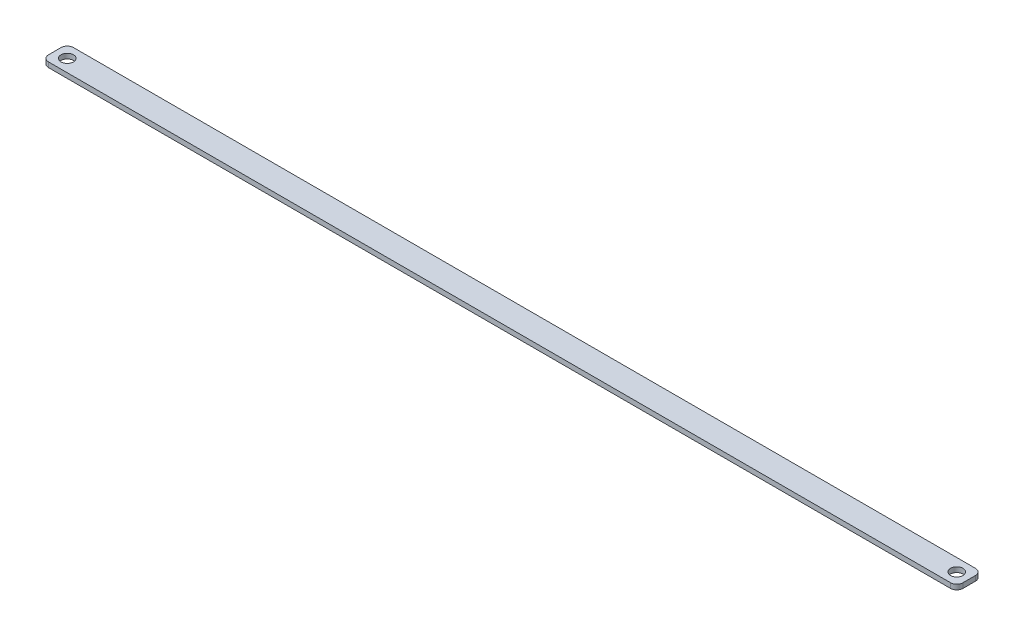
ISO-10303-21;
HEADER;
FILE_DESCRIPTION(('STEP AP214'),'2;1');
FILE_NAME('part.step','',(''),(''),'','','');
FILE_SCHEMA(('AUTOMOTIVE_DESIGN { 1 0 10303 214 1 1 1 1 }'));
ENDSEC;
DATA;
#1=APPLICATION_CONTEXT('core data for automotive mechanical design processes');
#2=APPLICATION_PROTOCOL_DEFINITION('international standard','automotive_design',2000,#1);
#3=PRODUCT_CONTEXT('',#1,'mechanical');
#4=PRODUCT('Part','Part','',(#3));
#5=PRODUCT_RELATED_PRODUCT_CATEGORY('part','',(#4));
#6=PRODUCT_DEFINITION_FORMATION('','',#4);
#7=PRODUCT_DEFINITION_CONTEXT('part definition',#1,'design');
#8=PRODUCT_DEFINITION('design','',#6,#7);
#9=PRODUCT_DEFINITION_SHAPE('','',#8);
#10=(LENGTH_UNIT() NAMED_UNIT(*) SI_UNIT(.MILLI.,.METRE.));
#11=(NAMED_UNIT(*) PLANE_ANGLE_UNIT() SI_UNIT($,.RADIAN.));
#12=(NAMED_UNIT(*) SI_UNIT($,.STERADIAN.) SOLID_ANGLE_UNIT());
#13=UNCERTAINTY_MEASURE_WITH_UNIT(LENGTH_MEASURE(1.E-05),#10,'distance_accuracy_value','');
#14=(GEOMETRIC_REPRESENTATION_CONTEXT(3) GLOBAL_UNCERTAINTY_ASSIGNED_CONTEXT((#13)) GLOBAL_UNIT_ASSIGNED_CONTEXT((#10,
#11,#12)) REPRESENTATION_CONTEXT('',''));
#15=CARTESIAN_POINT('',(0.,0.,0.));
#16=DIRECTION('',(0.,0.,1.));
#17=DIRECTION('',(1.,0.,0.));
#18=AXIS2_PLACEMENT_3D('',#15,#16,#17);
#19=CARTESIAN_POINT('',(207.32774118692,2.,-5.));
#20=DIRECTION('',(0.,-1.,0.));
#21=DIRECTION('',(0.,0.,-1.));
#22=AXIS2_PLACEMENT_3D('',#19,#20,#21);
#23=CYLINDRICAL_SURFACE('',#22,2.5);
#24=CARTESIAN_POINT('',(207.32774118692,0.,-5.));
#25=DIRECTION('',(0.,1.,0.));
#26=DIRECTION('',(0.,0.,1.));
#27=AXIS2_PLACEMENT_3D('',#24,#25,#26);
#28=CIRCLE('',#27,2.5);
#29=CARTESIAN_POINT('',(207.32774118692,0.,-2.5));
#30=VERTEX_POINT('',#29);
#31=EDGE_CURVE('E220',#30,#30,#28,.T.);
#32=ORIENTED_EDGE('',*,*,#31,.F.);
#33=EDGE_LOOP('',(#32));
#34=FACE_BOUND('',#33,.T.);
#35=CARTESIAN_POINT('',(207.32774118692,2.,-5.));
#36=DIRECTION('',(0.,1.,0.));
#37=DIRECTION('',(0.,0.,1.));
#38=AXIS2_PLACEMENT_3D('',#35,#36,#37);
#39=CIRCLE('',#38,2.5);
#40=CARTESIAN_POINT('',(207.32774118692,2.,-2.5));
#41=VERTEX_POINT('',#40);
#42=EDGE_CURVE('E13',#41,#41,#39,.T.);
#43=ORIENTED_EDGE('',*,*,#42,.T.);
#44=EDGE_LOOP('',(#43));
#45=FACE_BOUND('',#44,.T.);
#46=ADVANCED_FACE('F93',(#34,#45),#23,.F.);
#47=CARTESIAN_POINT('',(-149.67225881308,2.,-5.));
#48=DIRECTION('',(0.,-1.,0.));
#49=DIRECTION('',(0.,0.,-1.));
#50=AXIS2_PLACEMENT_3D('',#47,#48,#49);
#51=CYLINDRICAL_SURFACE('',#50,2.5);
#52=CARTESIAN_POINT('',(-149.67225881308,0.,-5.));
#53=DIRECTION('',(0.,1.,0.));
#54=DIRECTION('',(0.,0.,1.));
#55=AXIS2_PLACEMENT_3D('',#52,#53,#54);
#56=CIRCLE('',#55,2.5);
#57=CARTESIAN_POINT('',(-149.67225881308,0.,-2.5));
#58=VERTEX_POINT('',#57);
#59=EDGE_CURVE('E233',#58,#58,#56,.T.);
#60=ORIENTED_EDGE('',*,*,#59,.F.);
#61=EDGE_LOOP('',(#60));
#62=FACE_BOUND('',#61,.T.);
#63=CARTESIAN_POINT('',(-149.67225881308,2.,-5.));
#64=DIRECTION('',(0.,1.,0.));
#65=DIRECTION('',(0.,0.,1.));
#66=AXIS2_PLACEMENT_3D('',#63,#64,#65);
#67=CIRCLE('',#66,2.5);
#68=CARTESIAN_POINT('',(-149.67225881308,2.,-2.5));
#69=VERTEX_POINT('',#68);
#70=EDGE_CURVE('E103',#69,#69,#67,.T.);
#71=ORIENTED_EDGE('',*,*,#70,.T.);
#72=EDGE_LOOP('',(#71));
#73=FACE_BOUND('',#72,.T.);
#74=ADVANCED_FACE('F254',(#62,#73),#51,.F.);
#75=CARTESIAN_POINT('',(47.5,2.,-2.5));
#76=DIRECTION('',(0.,1.,0.));
#77=DIRECTION('',(0.,0.,1.));
#78=AXIS2_PLACEMENT_3D('',#75,#76,#77);
#79=PLANE('',#78);
#80=DIRECTION('',(1.,0.,0.));
#81=VECTOR('',#80,1.);
#82=CARTESIAN_POINT('',(-152.17225881308,2.,0.));
#83=LINE('',#82,#81);
#84=CARTESIAN_POINT('',(-152.17225881308,2.,0.));
#85=VERTEX_POINT('',#84);
#86=CARTESIAN_POINT('',(209.82774118692,2.,0.));
#87=VERTEX_POINT('',#86);
#88=EDGE_CURVE('E156',#85,#87,#83,.T.);
#89=ORIENTED_EDGE('',*,*,#88,.T.);
#90=CARTESIAN_POINT('',(209.82774118692,2.,-2.5));
#91=DIRECTION('',(0.,1.,0.));
#92=DIRECTION('',(0.,0.,1.));
#93=AXIS2_PLACEMENT_3D('',#90,#91,#92);
#94=CIRCLE('',#93,2.5);
#95=CARTESIAN_POINT('',(212.32774118692,2.,-2.50000000000002));
#96=VERTEX_POINT('',#95);
#97=EDGE_CURVE('E162',#87,#96,#94,.T.);
#98=ORIENTED_EDGE('',*,*,#97,.T.);
#99=DIRECTION('',(0.,0.,-1.));
#100=VECTOR('',#99,1.);
#101=CARTESIAN_POINT('',(212.32774118692,2.,-2.50000000000002));
#102=LINE('',#101,#100);
#103=CARTESIAN_POINT('',(212.32774118692,2.,-7.49999999999998));
#104=VERTEX_POINT('',#103);
#105=EDGE_CURVE('E184',#96,#104,#102,.T.);
#106=ORIENTED_EDGE('',*,*,#105,.T.);
#107=CARTESIAN_POINT('',(209.82774118692,2.,-7.5));
#108=DIRECTION('',(0.,1.,0.));
#109=DIRECTION('',(0.,0.,-1.));
#110=AXIS2_PLACEMENT_3D('',#107,#108,#109);
#111=CIRCLE('',#110,2.5);
#112=CARTESIAN_POINT('',(209.82774118692,2.,-10.));
#113=VERTEX_POINT('',#112);
#114=EDGE_CURVE('E188',#104,#113,#111,.T.);
#115=ORIENTED_EDGE('',*,*,#114,.T.);
#116=DIRECTION('',(-1.,0.,0.));
#117=VECTOR('',#116,1.);
#118=CARTESIAN_POINT('',(164.82774118692,2.,-10.));
#119=LINE('',#118,#117);
#120=CARTESIAN_POINT('',(-152.17225881308,2.,-10.));
#121=VERTEX_POINT('',#120);
#122=EDGE_CURVE('E242',#113,#121,#119,.T.);
#123=ORIENTED_EDGE('',*,*,#122,.T.);
#124=CARTESIAN_POINT('',(-152.17225881308,2.,-7.5));
#125=DIRECTION('',(0.,1.,0.));
#126=DIRECTION('',(0.,0.,-1.));
#127=AXIS2_PLACEMENT_3D('',#124,#125,#126);
#128=CIRCLE('',#127,2.5);
#129=CARTESIAN_POINT('',(-154.67225881308,2.,-7.49999999999998));
#130=VERTEX_POINT('',#129);
#131=EDGE_CURVE('E168',#121,#130,#128,.T.);
#132=ORIENTED_EDGE('',*,*,#131,.T.);
#133=DIRECTION('',(0.,0.,1.));
#134=VECTOR('',#133,1.);
#135=CARTESIAN_POINT('',(-154.67225881308,2.,-2.50000000000002));
#136=LINE('',#135,#134);
#137=CARTESIAN_POINT('',(-154.67225881308,2.,-2.50000000000002));
#138=VERTEX_POINT('',#137);
#139=EDGE_CURVE('E186',#130,#138,#136,.T.);
#140=ORIENTED_EDGE('',*,*,#139,.T.);
#141=CARTESIAN_POINT('',(-152.17225881308,2.,-2.5));
#142=DIRECTION('',(0.,1.,0.));
#143=DIRECTION('',(0.,0.,-1.));
#144=AXIS2_PLACEMENT_3D('',#141,#142,#143);
#145=CIRCLE('',#144,2.5);
#146=EDGE_CURVE('E165',#138,#85,#145,.T.);
#147=ORIENTED_EDGE('',*,*,#146,.T.);
#148=EDGE_LOOP('',(#89,#98,#106,#115,#123,#132,#140,#147));
#149=FACE_BOUND('',#148,.T.);
#150=ORIENTED_EDGE('',*,*,#42,.F.);
#151=EDGE_LOOP('',(#150));
#152=FACE_BOUND('',#151,.T.);
#153=ORIENTED_EDGE('',*,*,#70,.F.);
#154=EDGE_LOOP('',(#153));
#155=FACE_BOUND('',#154,.T.);
#156=ADVANCED_FACE('F158',(#149,#152,#155),#79,.T.);
#157=CARTESIAN_POINT('',(209.82774118692,0.,-2.5));
#158=DIRECTION('',(0.,1.,0.));
#159=DIRECTION('',(0.,0.,1.));
#160=AXIS2_PLACEMENT_3D('',#157,#158,#159);
#161=PLANE('',#160);
#162=ORIENTED_EDGE('',*,*,#31,.T.);
#163=EDGE_LOOP('',(#162));
#164=FACE_BOUND('',#163,.T.);
#165=CARTESIAN_POINT('',(209.82774118692,0.,-2.5));
#166=DIRECTION('',(0.,1.,0.));
#167=DIRECTION('',(0.,0.,1.));
#168=AXIS2_PLACEMENT_3D('',#165,#166,#167);
#169=CIRCLE('',#168,2.5);
#170=CARTESIAN_POINT('',(209.82774118692,0.,0.));
#171=VERTEX_POINT('',#170);
#172=CARTESIAN_POINT('',(212.32774118692,0.,-2.50000000000002));
#173=VERTEX_POINT('',#172);
#174=EDGE_CURVE('E177',#171,#173,#169,.T.);
#175=ORIENTED_EDGE('',*,*,#174,.F.);
#176=DIRECTION('',(1.,0.,0.));
#177=VECTOR('',#176,1.);
#178=CARTESIAN_POINT('',(-152.17225881308,0.,0.));
#179=LINE('',#178,#177);
#180=CARTESIAN_POINT('',(-152.17225881308,0.,0.));
#181=VERTEX_POINT('',#180);
#182=EDGE_CURVE('E173',#181,#171,#179,.T.);
#183=ORIENTED_EDGE('',*,*,#182,.F.);
#184=CARTESIAN_POINT('',(-152.17225881308,0.,-2.5));
#185=DIRECTION('',(0.,1.,0.));
#186=DIRECTION('',(0.,0.,-1.));
#187=AXIS2_PLACEMENT_3D('',#184,#185,#186);
#188=CIRCLE('',#187,2.5);
#189=CARTESIAN_POINT('',(-154.67225881308,0.,-2.50000000000002));
#190=VERTEX_POINT('',#189);
#191=EDGE_CURVE('E199',#190,#181,#188,.T.);
#192=ORIENTED_EDGE('',*,*,#191,.F.);
#193=DIRECTION('',(0.,0.,1.));
#194=VECTOR('',#193,1.);
#195=CARTESIAN_POINT('',(-154.67225881308,0.,-2.50000000000002));
#196=LINE('',#195,#194);
#197=CARTESIAN_POINT('',(-154.67225881308,0.,-7.49999999999998));
#198=VERTEX_POINT('',#197);
#199=EDGE_CURVE('E206',#198,#190,#196,.T.);
#200=ORIENTED_EDGE('',*,*,#199,.F.);
#201=CARTESIAN_POINT('',(-152.17225881308,0.,-7.5));
#202=DIRECTION('',(0.,1.,0.));
#203=DIRECTION('',(0.,0.,-1.));
#204=AXIS2_PLACEMENT_3D('',#201,#202,#203);
#205=CIRCLE('',#204,2.5);
#206=CARTESIAN_POINT('',(-152.17225881308,0.,-10.));
#207=VERTEX_POINT('',#206);
#208=EDGE_CURVE('E212',#207,#198,#205,.T.);
#209=ORIENTED_EDGE('',*,*,#208,.F.);
#210=DIRECTION('',(-1.,0.,0.));
#211=VECTOR('',#210,1.);
#212=CARTESIAN_POINT('',(164.82774118692,0.,-10.));
#213=LINE('',#212,#211);
#214=CARTESIAN_POINT('',(209.82774118692,0.,-10.));
#215=VERTEX_POINT('',#214);
#216=EDGE_CURVE('E218',#215,#207,#213,.T.);
#217=ORIENTED_EDGE('',*,*,#216,.F.);
#218=CARTESIAN_POINT('',(209.82774118692,0.,-7.5));
#219=DIRECTION('',(0.,1.,0.));
#220=DIRECTION('',(0.,0.,-1.));
#221=AXIS2_PLACEMENT_3D('',#218,#219,#220);
#222=CIRCLE('',#221,2.5);
#223=CARTESIAN_POINT('',(212.32774118692,0.,-7.49999999999998));
#224=VERTEX_POINT('',#223);
#225=EDGE_CURVE('E223',#224,#215,#222,.T.);
#226=ORIENTED_EDGE('',*,*,#225,.F.);
#227=DIRECTION('',(0.,0.,-1.));
#228=VECTOR('',#227,1.);
#229=CARTESIAN_POINT('',(212.32774118692,0.,-2.50000000000002));
#230=LINE('',#229,#228);
#231=EDGE_CURVE('E178',#173,#224,#230,.T.);
#232=ORIENTED_EDGE('',*,*,#231,.F.);
#233=EDGE_LOOP('',(#175,#183,#192,#200,#209,#217,#226,#232));
#234=FACE_BOUND('',#233,.T.);
#235=ORIENTED_EDGE('',*,*,#59,.T.);
#236=EDGE_LOOP('',(#235));
#237=FACE_BOUND('',#236,.T.);
#238=ADVANCED_FACE('F249',(#164,#234,#237),#161,.F.);
#239=CARTESIAN_POINT('',(164.82774118692,2.,-10.));
#240=DIRECTION('',(0.,0.,1.));
#241=DIRECTION('',(1.,0.,0.));
#242=AXIS2_PLACEMENT_3D('',#239,#240,#241);
#243=PLANE('',#242);
#244=ORIENTED_EDGE('',*,*,#216,.T.);
#245=DIRECTION('',(0.,-1.,0.));
#246=VECTOR('',#245,1.);
#247=CARTESIAN_POINT('',(-152.17225881308,2.,-10.));
#248=LINE('',#247,#246);
#249=EDGE_CURVE('E209',#121,#207,#248,.T.);
#250=ORIENTED_EDGE('',*,*,#249,.F.);
#251=ORIENTED_EDGE('',*,*,#122,.F.);
#252=DIRECTION('',(0.,-1.,0.));
#253=VECTOR('',#252,1.);
#254=CARTESIAN_POINT('',(209.82774118692,2.,-10.));
#255=LINE('',#254,#253);
#256=EDGE_CURVE('E112',#113,#215,#255,.T.);
#257=ORIENTED_EDGE('',*,*,#256,.T.);
#258=EDGE_LOOP('',(#244,#250,#251,#257));
#259=FACE_BOUND('',#258,.T.);
#260=ADVANCED_FACE('F271',(#259),#243,.F.);
#261=CARTESIAN_POINT('',(164.82774118692,2.,0.));
#262=DIRECTION('',(0.,0.,-1.));
#263=DIRECTION('',(-1.,0.,0.));
#264=AXIS2_PLACEMENT_3D('',#261,#262,#263);
#265=PLANE('',#264);
#266=DIRECTION('',(0.,-1.,0.));
#267=VECTOR('',#266,1.);
#268=CARTESIAN_POINT('',(209.82774118692,2.,0.));
#269=LINE('',#268,#267);
#270=EDGE_CURVE('E171',#87,#171,#269,.T.);
#271=ORIENTED_EDGE('',*,*,#270,.F.);
#272=ORIENTED_EDGE('',*,*,#88,.F.);
#273=DIRECTION('',(0.,-1.,0.));
#274=VECTOR('',#273,1.);
#275=CARTESIAN_POINT('',(-152.17225881308,2.,0.));
#276=LINE('',#275,#274);
#277=EDGE_CURVE('E196',#85,#181,#276,.T.);
#278=ORIENTED_EDGE('',*,*,#277,.T.);
#279=ORIENTED_EDGE('',*,*,#182,.T.);
#280=EDGE_LOOP('',(#271,#272,#278,#279));
#281=FACE_BOUND('',#280,.T.);
#282=ADVANCED_FACE('F172',(#281),#265,.F.);
#283=CARTESIAN_POINT('',(209.82774118692,2.,-2.5));
#284=DIRECTION('',(0.,-1.,0.));
#285=DIRECTION('',(0.,0.,-1.));
#286=AXIS2_PLACEMENT_3D('',#283,#284,#285);
#287=CYLINDRICAL_SURFACE('',#286,2.5);
#288=ORIENTED_EDGE('',*,*,#174,.T.);
#289=DIRECTION('',(0.,-1.,0.));
#290=VECTOR('',#289,1.);
#291=CARTESIAN_POINT('',(212.32774118692,2.,-2.50000000000002));
#292=LINE('',#291,#290);
#293=EDGE_CURVE('E182',#96,#173,#292,.T.);
#294=ORIENTED_EDGE('',*,*,#293,.F.);
#295=ORIENTED_EDGE('',*,*,#97,.F.);
#296=ORIENTED_EDGE('',*,*,#270,.T.);
#297=EDGE_LOOP('',(#288,#294,#295,#296));
#298=FACE_BOUND('',#297,.T.);
#299=ADVANCED_FACE('F180',(#298),#287,.T.);
#300=CARTESIAN_POINT('',(212.32774118692,2.,-2.50000000000002));
#301=DIRECTION('',(-1.,0.,0.));
#302=DIRECTION('',(0.,0.,1.));
#303=AXIS2_PLACEMENT_3D('',#300,#301,#302);
#304=PLANE('',#303);
#305=ORIENTED_EDGE('',*,*,#231,.T.);
#306=DIRECTION('',(0.,-1.,0.));
#307=VECTOR('',#306,1.);
#308=CARTESIAN_POINT('',(212.32774118692,2.,-7.49999999999998));
#309=LINE('',#308,#307);
#310=EDGE_CURVE('E215',#104,#224,#309,.T.);
#311=ORIENTED_EDGE('',*,*,#310,.F.);
#312=ORIENTED_EDGE('',*,*,#105,.F.);
#313=ORIENTED_EDGE('',*,*,#293,.T.);
#314=EDGE_LOOP('',(#305,#311,#312,#313));
#315=FACE_BOUND('',#314,.T.);
#316=ADVANCED_FACE('F278',(#315),#304,.F.);
#317=CARTESIAN_POINT('',(209.82774118692,2.,-7.5));
#318=DIRECTION('',(0.,-1.,0.));
#319=DIRECTION('',(0.,0.,-1.));
#320=AXIS2_PLACEMENT_3D('',#317,#318,#319);
#321=CYLINDRICAL_SURFACE('',#320,2.5);
#322=ORIENTED_EDGE('',*,*,#225,.T.);
#323=ORIENTED_EDGE('',*,*,#256,.F.);
#324=ORIENTED_EDGE('',*,*,#114,.F.);
#325=ORIENTED_EDGE('',*,*,#310,.T.);
#326=EDGE_LOOP('',(#322,#323,#324,#325));
#327=FACE_BOUND('',#326,.T.);
#328=ADVANCED_FACE('F281',(#327),#321,.T.);
#329=CARTESIAN_POINT('',(-152.17225881308,2.,-7.5));
#330=DIRECTION('',(0.,-1.,0.));
#331=DIRECTION('',(0.,0.,-1.));
#332=AXIS2_PLACEMENT_3D('',#329,#330,#331);
#333=CYLINDRICAL_SURFACE('',#332,2.5);
#334=ORIENTED_EDGE('',*,*,#208,.T.);
#335=DIRECTION('',(0.,-1.,0.));
#336=VECTOR('',#335,1.);
#337=CARTESIAN_POINT('',(-154.67225881308,2.,-7.49999999999998));
#338=LINE('',#337,#336);
#339=EDGE_CURVE('E202',#130,#198,#338,.T.);
#340=ORIENTED_EDGE('',*,*,#339,.F.);
#341=ORIENTED_EDGE('',*,*,#131,.F.);
#342=ORIENTED_EDGE('',*,*,#249,.T.);
#343=EDGE_LOOP('',(#334,#340,#341,#342));
#344=FACE_BOUND('',#343,.T.);
#345=ADVANCED_FACE('F285',(#344),#333,.T.);
#346=CARTESIAN_POINT('',(-154.67225881308,2.,-2.50000000000002));
#347=DIRECTION('',(1.,0.,0.));
#348=DIRECTION('',(0.,0.,-1.));
#349=AXIS2_PLACEMENT_3D('',#346,#347,#348);
#350=PLANE('',#349);
#351=ORIENTED_EDGE('',*,*,#199,.T.);
#352=DIRECTION('',(0.,-1.,0.));
#353=VECTOR('',#352,1.);
#354=CARTESIAN_POINT('',(-154.67225881308,2.,-2.50000000000002));
#355=LINE('',#354,#353);
#356=EDGE_CURVE('E203',#138,#190,#355,.T.);
#357=ORIENTED_EDGE('',*,*,#356,.F.);
#358=ORIENTED_EDGE('',*,*,#139,.F.);
#359=ORIENTED_EDGE('',*,*,#339,.T.);
#360=EDGE_LOOP('',(#351,#357,#358,#359));
#361=FACE_BOUND('',#360,.T.);
#362=ADVANCED_FACE('F288',(#361),#350,.F.);
#363=CARTESIAN_POINT('',(-152.17225881308,2.,-2.5));
#364=DIRECTION('',(0.,-1.,0.));
#365=DIRECTION('',(0.,0.,-1.));
#366=AXIS2_PLACEMENT_3D('',#363,#364,#365);
#367=CYLINDRICAL_SURFACE('',#366,2.5);
#368=ORIENTED_EDGE('',*,*,#191,.T.);
#369=ORIENTED_EDGE('',*,*,#277,.F.);
#370=ORIENTED_EDGE('',*,*,#146,.F.);
#371=ORIENTED_EDGE('',*,*,#356,.T.);
#372=EDGE_LOOP('',(#368,#369,#370,#371));
#373=FACE_BOUND('',#372,.T.);
#374=ADVANCED_FACE('F95',(#373),#367,.T.);
#375=CLOSED_SHELL('',(#46,#74,#156,#238,#260,#282,#299,#316,#328,#345,#362,#374));
#376=MANIFOLD_SOLID_BREP('B2',#375);
#377=ADVANCED_BREP_SHAPE_REPRESENTATION('',(#18,#376),#14);
#378=SHAPE_DEFINITION_REPRESENTATION(#9,#377);
ENDSEC;
END-ISO-10303-21;
